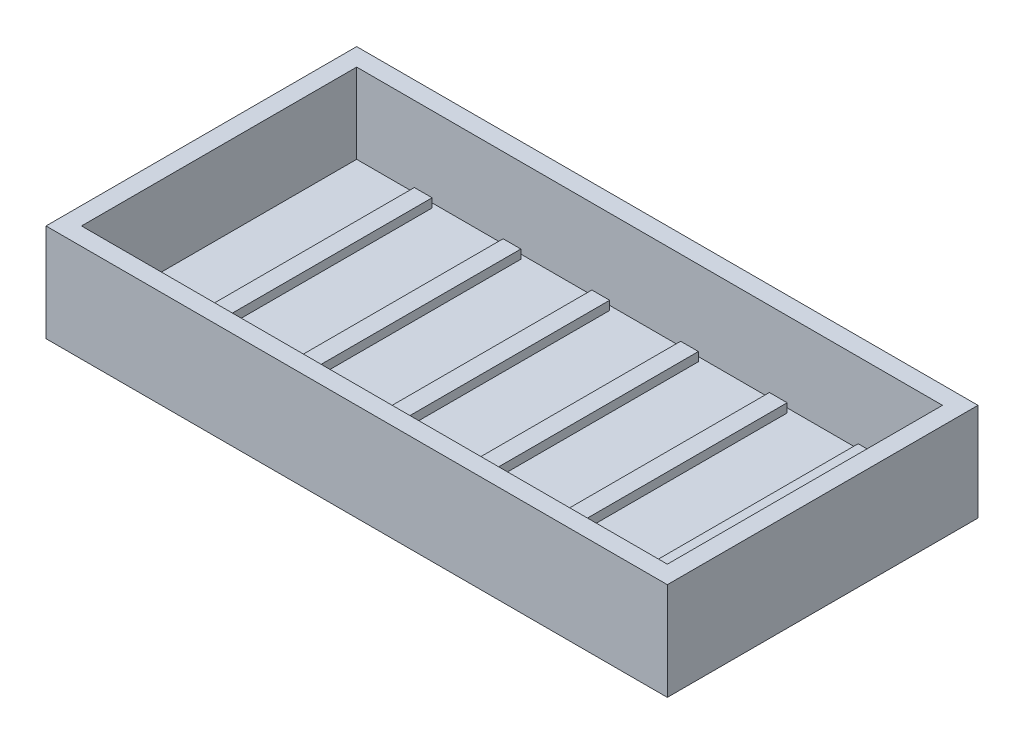
ISO-10303-21;
HEADER;
FILE_DESCRIPTION(('STEP AP214'),'2;1');
FILE_NAME('part.step','',(''),(''),'','','');
FILE_SCHEMA(('AUTOMOTIVE_DESIGN { 1 0 10303 214 1 1 1 1 }'));
ENDSEC;
DATA;
#1=APPLICATION_CONTEXT('core data for automotive mechanical design processes');
#2=APPLICATION_PROTOCOL_DEFINITION('international standard','automotive_design',2000,#1);
#3=PRODUCT_CONTEXT('',#1,'mechanical');
#4=PRODUCT('Part','Part','',(#3));
#5=PRODUCT_RELATED_PRODUCT_CATEGORY('part','',(#4));
#6=PRODUCT_DEFINITION_FORMATION('','',#4);
#7=PRODUCT_DEFINITION_CONTEXT('part definition',#1,'design');
#8=PRODUCT_DEFINITION('design','',#6,#7);
#9=PRODUCT_DEFINITION_SHAPE('','',#8);
#10=(LENGTH_UNIT() NAMED_UNIT(*) SI_UNIT(.MILLI.,.METRE.));
#11=(NAMED_UNIT(*) PLANE_ANGLE_UNIT() SI_UNIT($,.RADIAN.));
#12=(NAMED_UNIT(*) SI_UNIT($,.STERADIAN.) SOLID_ANGLE_UNIT());
#13=UNCERTAINTY_MEASURE_WITH_UNIT(LENGTH_MEASURE(1.E-05),#10,'distance_accuracy_value','');
#14=(GEOMETRIC_REPRESENTATION_CONTEXT(3) GLOBAL_UNCERTAINTY_ASSIGNED_CONTEXT((#13)) GLOBAL_UNIT_ASSIGNED_CONTEXT((#10,
#11,#12)) REPRESENTATION_CONTEXT('',''));
#15=CARTESIAN_POINT('',(0.,0.,0.));
#16=DIRECTION('',(0.,0.,1.));
#17=DIRECTION('',(1.,0.,0.));
#18=AXIS2_PLACEMENT_3D('',#15,#16,#17);
#19=CARTESIAN_POINT('',(0.,4.,0.));
#20=DIRECTION('',(0.,1.,0.));
#21=DIRECTION('',(0.,0.,1.));
#22=AXIS2_PLACEMENT_3D('',#19,#20,#21);
#23=PLANE('',#22);
#24=DIRECTION('',(0.,0.,1.));
#25=VECTOR('',#24,1.);
#26=CARTESIAN_POINT('',(-66.,4.,4.));
#27=LINE('',#26,#25);
#28=CARTESIAN_POINT('',(-66.,4.,4.));
#29=VERTEX_POINT('',#28);
#30=CARTESIAN_POINT('',(-66.,4.,66.));
#31=VERTEX_POINT('',#30);
#32=EDGE_CURVE('E497',#29,#31,#27,.T.);
#33=ORIENTED_EDGE('',*,*,#32,.T.);
#34=DIRECTION('',(1.,0.,0.));
#35=VECTOR('',#34,1.);
#36=CARTESIAN_POINT('',(-66.,4.,66.));
#37=LINE('',#36,#35);
#38=CARTESIAN_POINT('',(66.,4.,66.));
#39=VERTEX_POINT('',#38);
#40=EDGE_CURVE('E498',#31,#39,#37,.T.);
#41=ORIENTED_EDGE('',*,*,#40,.T.);
#42=DIRECTION('',(0.,0.,-1.));
#43=VECTOR('',#42,1.);
#44=CARTESIAN_POINT('',(66.,4.,66.));
#45=LINE('',#44,#43);
#46=CARTESIAN_POINT('',(66.,4.,4.));
#47=VERTEX_POINT('',#46);
#48=EDGE_CURVE('E504',#39,#47,#45,.T.);
#49=ORIENTED_EDGE('',*,*,#48,.T.);
#50=DIRECTION('',(-1.,0.,0.));
#51=VECTOR('',#50,1.);
#52=CARTESIAN_POINT('',(66.,4.,4.));
#53=LINE('',#52,#51);
#54=EDGE_CURVE('E506',#47,#29,#53,.T.);
#55=ORIENTED_EDGE('',*,*,#54,.T.);
#56=EDGE_LOOP('',(#33,#41,#49,#55));
#57=FACE_BOUND('',#56,.T.);
#58=DIRECTION('',(1.,0.,0.));
#59=VECTOR('',#58,1.);
#60=CARTESIAN_POINT('',(48.,4.,65.));
#61=LINE('',#60,#59);
#62=CARTESIAN_POINT('',(48.,4.,65.));
#63=VERTEX_POINT('',#62);
#64=CARTESIAN_POINT('',(52.,4.,65.));
#65=VERTEX_POINT('',#64);
#66=EDGE_CURVE('E479',#63,#65,#61,.T.);
#67=ORIENTED_EDGE('',*,*,#66,.F.);
#68=DIRECTION('',(0.,0.,1.));
#69=VECTOR('',#68,1.);
#70=CARTESIAN_POINT('',(48.,4.,5.));
#71=LINE('',#70,#69);
#72=CARTESIAN_POINT('',(48.,4.,5.));
#73=VERTEX_POINT('',#72);
#74=EDGE_CURVE('E420',#73,#63,#71,.T.);
#75=ORIENTED_EDGE('',*,*,#74,.F.);
#76=DIRECTION('',(-1.,0.,0.));
#77=VECTOR('',#76,1.);
#78=CARTESIAN_POINT('',(52.,4.,5.));
#79=LINE('',#78,#77);
#80=CARTESIAN_POINT('',(52.,4.,5.));
#81=VERTEX_POINT('',#80);
#82=EDGE_CURVE('E473',#81,#73,#79,.T.);
#83=ORIENTED_EDGE('',*,*,#82,.F.);
#84=DIRECTION('',(0.,0.,-1.));
#85=VECTOR('',#84,1.);
#86=CARTESIAN_POINT('',(52.,4.,65.));
#87=LINE('',#86,#85);
#88=EDGE_CURVE('E475',#65,#81,#87,.T.);
#89=ORIENTED_EDGE('',*,*,#88,.F.);
#90=EDGE_LOOP('',(#67,#75,#83,#89));
#91=FACE_BOUND('',#90,.T.);
#92=DIRECTION('',(1.,0.,0.));
#93=VECTOR('',#92,1.);
#94=CARTESIAN_POINT('',(28.,4.,65.));
#95=LINE('',#94,#93);
#96=CARTESIAN_POINT('',(28.,4.,65.));
#97=VERTEX_POINT('',#96);
#98=CARTESIAN_POINT('',(32.,4.,65.));
#99=VERTEX_POINT('',#98);
#100=EDGE_CURVE('E438',#97,#99,#95,.T.);
#101=ORIENTED_EDGE('',*,*,#100,.F.);
#102=DIRECTION('',(0.,0.,1.));
#103=VECTOR('',#102,1.);
#104=CARTESIAN_POINT('',(28.,4.,5.));
#105=LINE('',#104,#103);
#106=CARTESIAN_POINT('',(28.,4.,5.));
#107=VERTEX_POINT('',#106);
#108=EDGE_CURVE('E378',#107,#97,#105,.T.);
#109=ORIENTED_EDGE('',*,*,#108,.F.);
#110=DIRECTION('',(-1.,0.,0.));
#111=VECTOR('',#110,1.);
#112=CARTESIAN_POINT('',(32.,4.,5.));
#113=LINE('',#112,#111);
#114=CARTESIAN_POINT('',(32.,4.,5.));
#115=VERTEX_POINT('',#114);
#116=EDGE_CURVE('E431',#115,#107,#113,.T.);
#117=ORIENTED_EDGE('',*,*,#116,.F.);
#118=DIRECTION('',(0.,0.,-1.));
#119=VECTOR('',#118,1.);
#120=CARTESIAN_POINT('',(32.,4.,65.));
#121=LINE('',#120,#119);
#122=EDGE_CURVE('E432',#99,#115,#121,.T.);
#123=ORIENTED_EDGE('',*,*,#122,.F.);
#124=EDGE_LOOP('',(#101,#109,#117,#123));
#125=FACE_BOUND('',#124,.T.);
#126=DIRECTION('',(1.,0.,0.));
#127=VECTOR('',#126,1.);
#128=CARTESIAN_POINT('',(8.,4.,65.));
#129=LINE('',#128,#127);
#130=CARTESIAN_POINT('',(8.,4.,65.));
#131=VERTEX_POINT('',#130);
#132=CARTESIAN_POINT('',(12.,4.,65.));
#133=VERTEX_POINT('',#132);
#134=EDGE_CURVE('E400',#131,#133,#129,.T.);
#135=ORIENTED_EDGE('',*,*,#134,.F.);
#136=DIRECTION('',(0.,0.,1.));
#137=VECTOR('',#136,1.);
#138=CARTESIAN_POINT('',(8.,4.,5.));
#139=LINE('',#138,#137);
#140=CARTESIAN_POINT('',(8.,4.,5.));
#141=VERTEX_POINT('',#140);
#142=EDGE_CURVE('E340',#141,#131,#139,.T.);
#143=ORIENTED_EDGE('',*,*,#142,.F.);
#144=DIRECTION('',(-1.,0.,0.));
#145=VECTOR('',#144,1.);
#146=CARTESIAN_POINT('',(12.,4.,5.));
#147=LINE('',#146,#145);
#148=CARTESIAN_POINT('',(12.,4.,5.));
#149=VERTEX_POINT('',#148);
#150=EDGE_CURVE('E388',#149,#141,#147,.T.);
#151=ORIENTED_EDGE('',*,*,#150,.F.);
#152=DIRECTION('',(0.,0.,-1.));
#153=VECTOR('',#152,1.);
#154=CARTESIAN_POINT('',(12.,4.,65.));
#155=LINE('',#154,#153);
#156=EDGE_CURVE('E392',#133,#149,#155,.T.);
#157=ORIENTED_EDGE('',*,*,#156,.F.);
#158=EDGE_LOOP('',(#135,#143,#151,#157));
#159=FACE_BOUND('',#158,.T.);
#160=DIRECTION('',(1.,0.,0.));
#161=VECTOR('',#160,1.);
#162=CARTESIAN_POINT('',(-12.,4.,65.));
#163=LINE('',#162,#161);
#164=CARTESIAN_POINT('',(-12.,4.,65.));
#165=VERTEX_POINT('',#164);
#166=CARTESIAN_POINT('',(-8.,4.,65.));
#167=VERTEX_POINT('',#166);
#168=EDGE_CURVE('E359',#165,#167,#163,.T.);
#169=ORIENTED_EDGE('',*,*,#168,.F.);
#170=DIRECTION('',(0.,0.,1.));
#171=VECTOR('',#170,1.);
#172=CARTESIAN_POINT('',(-12.,4.,5.));
#173=LINE('',#172,#171);
#174=CARTESIAN_POINT('',(-12.,4.,5.));
#175=VERTEX_POINT('',#174);
#176=EDGE_CURVE('E300',#175,#165,#173,.T.);
#177=ORIENTED_EDGE('',*,*,#176,.F.);
#178=DIRECTION('',(-1.,0.,0.));
#179=VECTOR('',#178,1.);
#180=CARTESIAN_POINT('',(-8.,4.,5.));
#181=LINE('',#180,#179);
#182=CARTESIAN_POINT('',(-8.,4.,5.));
#183=VERTEX_POINT('',#182);
#184=EDGE_CURVE('E349',#183,#175,#181,.T.);
#185=ORIENTED_EDGE('',*,*,#184,.F.);
#186=DIRECTION('',(0.,0.,-1.));
#187=VECTOR('',#186,1.);
#188=CARTESIAN_POINT('',(-8.,4.,65.));
#189=LINE('',#188,#187);
#190=EDGE_CURVE('E355',#167,#183,#189,.T.);
#191=ORIENTED_EDGE('',*,*,#190,.F.);
#192=EDGE_LOOP('',(#169,#177,#185,#191));
#193=FACE_BOUND('',#192,.T.);
#194=DIRECTION('',(1.,0.,0.));
#195=VECTOR('',#194,1.);
#196=CARTESIAN_POINT('',(-32.,4.,65.));
#197=LINE('',#196,#195);
#198=CARTESIAN_POINT('',(-32.,4.,65.));
#199=VERTEX_POINT('',#198);
#200=CARTESIAN_POINT('',(-28.,4.,65.));
#201=VERTEX_POINT('',#200);
#202=EDGE_CURVE('E312',#199,#201,#197,.T.);
#203=ORIENTED_EDGE('',*,*,#202,.F.);
#204=DIRECTION('',(0.,0.,1.));
#205=VECTOR('',#204,1.);
#206=CARTESIAN_POINT('',(-32.,4.,5.));
#207=LINE('',#206,#205);
#208=CARTESIAN_POINT('',(-32.,4.,5.));
#209=VERTEX_POINT('',#208);
#210=EDGE_CURVE('E318',#209,#199,#207,.T.);
#211=ORIENTED_EDGE('',*,*,#210,.F.);
#212=DIRECTION('',(-1.,0.,0.));
#213=VECTOR('',#212,1.);
#214=CARTESIAN_POINT('',(-28.,4.,5.));
#215=LINE('',#214,#213);
#216=CARTESIAN_POINT('',(-28.,4.,5.));
#217=VERTEX_POINT('',#216);
#218=EDGE_CURVE('E306',#217,#209,#215,.T.);
#219=ORIENTED_EDGE('',*,*,#218,.F.);
#220=DIRECTION('',(0.,0.,-1.));
#221=VECTOR('',#220,1.);
#222=CARTESIAN_POINT('',(-28.,4.,65.));
#223=LINE('',#222,#221);
#224=EDGE_CURVE('E313',#201,#217,#223,.T.);
#225=ORIENTED_EDGE('',*,*,#224,.F.);
#226=EDGE_LOOP('',(#203,#211,#219,#225));
#227=FACE_BOUND('',#226,.T.);
#228=DIRECTION('',(1.,0.,0.));
#229=VECTOR('',#228,1.);
#230=CARTESIAN_POINT('',(-52.,4.,65.));
#231=LINE('',#230,#229);
#232=CARTESIAN_POINT('',(-52.,4.,65.));
#233=VERTEX_POINT('',#232);
#234=CARTESIAN_POINT('',(-48.,4.,65.));
#235=VERTEX_POINT('',#234);
#236=EDGE_CURVE('E969',#233,#235,#231,.T.);
#237=ORIENTED_EDGE('',*,*,#236,.F.);
#238=DIRECTION('',(0.,0.,1.));
#239=VECTOR('',#238,1.);
#240=CARTESIAN_POINT('',(-52.,4.,5.));
#241=LINE('',#240,#239);
#242=CARTESIAN_POINT('',(-52.,4.,5.));
#243=VERTEX_POINT('',#242);
#244=EDGE_CURVE('E281',#243,#233,#241,.T.);
#245=ORIENTED_EDGE('',*,*,#244,.F.);
#246=DIRECTION('',(-1.,0.,0.));
#247=VECTOR('',#246,1.);
#248=CARTESIAN_POINT('',(-48.,4.,5.));
#249=LINE('',#248,#247);
#250=CARTESIAN_POINT('',(-48.,4.,5.));
#251=VERTEX_POINT('',#250);
#252=EDGE_CURVE('E280',#251,#243,#249,.T.);
#253=ORIENTED_EDGE('',*,*,#252,.F.);
#254=DIRECTION('',(0.,0.,-1.));
#255=VECTOR('',#254,1.);
#256=CARTESIAN_POINT('',(-48.,4.,65.));
#257=LINE('',#256,#255);
#258=EDGE_CURVE('E968',#235,#251,#257,.T.);
#259=ORIENTED_EDGE('',*,*,#258,.F.);
#260=EDGE_LOOP('',(#237,#245,#253,#259));
#261=FACE_BOUND('',#260,.T.);
#262=ADVANCED_FACE('F44',(#57,#91,#125,#159,#193,#227,#261),#23,.T.);
#263=CARTESIAN_POINT('',(-70.,22.,0.));
#264=DIRECTION('',(1.,0.,0.));
#265=DIRECTION('',(0.,0.,-1.));
#266=AXIS2_PLACEMENT_3D('',#263,#264,#265);
#267=PLANE('',#266);
#268=DIRECTION('',(0.,0.,1.));
#269=VECTOR('',#268,1.);
#270=CARTESIAN_POINT('',(-70.,0.,0.));
#271=LINE('',#270,#269);
#272=CARTESIAN_POINT('',(-70.,0.,0.));
#273=VERTEX_POINT('',#272);
#274=CARTESIAN_POINT('',(-70.,0.,70.));
#275=VERTEX_POINT('',#274);
#276=EDGE_CURVE('E527',#273,#275,#271,.T.);
#277=ORIENTED_EDGE('',*,*,#276,.T.);
#278=DIRECTION('',(0.,-1.,0.));
#279=VECTOR('',#278,1.);
#280=CARTESIAN_POINT('',(-70.,22.,70.));
#281=LINE('',#280,#279);
#282=CARTESIAN_POINT('',(-70.,22.,70.));
#283=VERTEX_POINT('',#282);
#284=EDGE_CURVE('E11',#283,#275,#281,.T.);
#285=ORIENTED_EDGE('',*,*,#284,.F.);
#286=DIRECTION('',(0.,0.,1.));
#287=VECTOR('',#286,1.);
#288=CARTESIAN_POINT('',(-70.,22.,0.));
#289=LINE('',#288,#287);
#290=CARTESIAN_POINT('',(-70.,22.,0.));
#291=VERTEX_POINT('',#290);
#292=EDGE_CURVE('E540',#291,#283,#289,.T.);
#293=ORIENTED_EDGE('',*,*,#292,.F.);
#294=DIRECTION('',(0.,-1.,0.));
#295=VECTOR('',#294,1.);
#296=CARTESIAN_POINT('',(-70.,22.,0.));
#297=LINE('',#296,#295);
#298=EDGE_CURVE('E552',#291,#273,#297,.T.);
#299=ORIENTED_EDGE('',*,*,#298,.T.);
#300=EDGE_LOOP('',(#277,#285,#293,#299));
#301=FACE_BOUND('',#300,.T.);
#302=ADVANCED_FACE('F50',(#301),#267,.F.);
#303=CARTESIAN_POINT('',(-70.,22.,70.));
#304=DIRECTION('',(0.,0.,-1.));
#305=DIRECTION('',(-1.,0.,0.));
#306=AXIS2_PLACEMENT_3D('',#303,#304,#305);
#307=PLANE('',#306);
#308=DIRECTION('',(1.,0.,0.));
#309=VECTOR('',#308,1.);
#310=CARTESIAN_POINT('',(-70.,0.,70.));
#311=LINE('',#310,#309);
#312=CARTESIAN_POINT('',(70.,0.,70.));
#313=VERTEX_POINT('',#312);
#314=EDGE_CURVE('E553',#275,#313,#311,.T.);
#315=ORIENTED_EDGE('',*,*,#314,.T.);
#316=DIRECTION('',(0.,-1.,0.));
#317=VECTOR('',#316,1.);
#318=CARTESIAN_POINT('',(70.,22.,70.));
#319=LINE('',#318,#317);
#320=CARTESIAN_POINT('',(70.,22.,70.));
#321=VERTEX_POINT('',#320);
#322=EDGE_CURVE('E53',#321,#313,#319,.T.);
#323=ORIENTED_EDGE('',*,*,#322,.F.);
#324=DIRECTION('',(1.,0.,0.));
#325=VECTOR('',#324,1.);
#326=CARTESIAN_POINT('',(-70.,22.,70.));
#327=LINE('',#326,#325);
#328=EDGE_CURVE('E541',#283,#321,#327,.T.);
#329=ORIENTED_EDGE('',*,*,#328,.F.);
#330=ORIENTED_EDGE('',*,*,#284,.T.);
#331=EDGE_LOOP('',(#315,#323,#329,#330));
#332=FACE_BOUND('',#331,.T.);
#333=ADVANCED_FACE('F591',(#332),#307,.F.);
#334=CARTESIAN_POINT('',(70.,22.,70.));
#335=DIRECTION('',(-1.,0.,0.));
#336=DIRECTION('',(0.,0.,1.));
#337=AXIS2_PLACEMENT_3D('',#334,#335,#336);
#338=PLANE('',#337);
#339=DIRECTION('',(0.,0.,-1.));
#340=VECTOR('',#339,1.);
#341=CARTESIAN_POINT('',(70.,0.,70.));
#342=LINE('',#341,#340);
#343=CARTESIAN_POINT('',(70.,0.,0.));
#344=VERTEX_POINT('',#343);
#345=EDGE_CURVE('E557',#313,#344,#342,.T.);
#346=ORIENTED_EDGE('',*,*,#345,.T.);
#347=DIRECTION('',(0.,-1.,0.));
#348=VECTOR('',#347,1.);
#349=CARTESIAN_POINT('',(70.,22.,0.));
#350=LINE('',#349,#348);
#351=CARTESIAN_POINT('',(70.,22.,0.));
#352=VERTEX_POINT('',#351);
#353=EDGE_CURVE('E567',#352,#344,#350,.T.);
#354=ORIENTED_EDGE('',*,*,#353,.F.);
#355=DIRECTION('',(0.,0.,-1.));
#356=VECTOR('',#355,1.);
#357=CARTESIAN_POINT('',(70.,22.,70.));
#358=LINE('',#357,#356);
#359=EDGE_CURVE('E544',#321,#352,#358,.T.);
#360=ORIENTED_EDGE('',*,*,#359,.F.);
#361=ORIENTED_EDGE('',*,*,#322,.T.);
#362=EDGE_LOOP('',(#346,#354,#360,#361));
#363=FACE_BOUND('',#362,.T.);
#364=ADVANCED_FACE('F574',(#363),#338,.F.);
#365=CARTESIAN_POINT('',(70.,22.,0.));
#366=DIRECTION('',(0.,0.,1.));
#367=DIRECTION('',(1.,0.,0.));
#368=AXIS2_PLACEMENT_3D('',#365,#366,#367);
#369=PLANE('',#368);
#370=DIRECTION('',(-1.,0.,0.));
#371=VECTOR('',#370,1.);
#372=CARTESIAN_POINT('',(70.,0.,0.));
#373=LINE('',#372,#371);
#374=EDGE_CURVE('E545',#344,#273,#373,.T.);
#375=ORIENTED_EDGE('',*,*,#374,.T.);
#376=ORIENTED_EDGE('',*,*,#298,.F.);
#377=DIRECTION('',(-1.,0.,0.));
#378=VECTOR('',#377,1.);
#379=CARTESIAN_POINT('',(70.,22.,0.));
#380=LINE('',#379,#378);
#381=EDGE_CURVE('E547',#352,#291,#380,.T.);
#382=ORIENTED_EDGE('',*,*,#381,.F.);
#383=ORIENTED_EDGE('',*,*,#353,.T.);
#384=EDGE_LOOP('',(#375,#376,#382,#383));
#385=FACE_BOUND('',#384,.T.);
#386=ADVANCED_FACE('F585',(#385),#369,.F.);
#387=CARTESIAN_POINT('',(0.,22.,0.));
#388=DIRECTION('',(0.,1.,0.));
#389=DIRECTION('',(0.,0.,1.));
#390=AXIS2_PLACEMENT_3D('',#387,#388,#389);
#391=PLANE('',#390);
#392=DIRECTION('',(0.,0.,1.));
#393=VECTOR('',#392,1.);
#394=CARTESIAN_POINT('',(-66.,22.,4.));
#395=LINE('',#394,#393);
#396=CARTESIAN_POINT('',(-66.,22.,4.));
#397=VERTEX_POINT('',#396);
#398=CARTESIAN_POINT('',(-66.,22.,66.));
#399=VERTEX_POINT('',#398);
#400=EDGE_CURVE('E283',#397,#399,#395,.T.);
#401=ORIENTED_EDGE('',*,*,#400,.F.);
#402=DIRECTION('',(-1.,0.,0.));
#403=VECTOR('',#402,1.);
#404=CARTESIAN_POINT('',(66.,22.,4.));
#405=LINE('',#404,#403);
#406=CARTESIAN_POINT('',(66.,22.,4.));
#407=VERTEX_POINT('',#406);
#408=EDGE_CURVE('E501',#407,#397,#405,.T.);
#409=ORIENTED_EDGE('',*,*,#408,.F.);
#410=DIRECTION('',(0.,0.,-1.));
#411=VECTOR('',#410,1.);
#412=CARTESIAN_POINT('',(66.,22.,66.));
#413=LINE('',#412,#411);
#414=CARTESIAN_POINT('',(66.,22.,66.));
#415=VERTEX_POINT('',#414);
#416=EDGE_CURVE('E520',#415,#407,#413,.T.);
#417=ORIENTED_EDGE('',*,*,#416,.F.);
#418=DIRECTION('',(1.,0.,0.));
#419=VECTOR('',#418,1.);
#420=CARTESIAN_POINT('',(-66.,22.,66.));
#421=LINE('',#420,#419);
#422=EDGE_CURVE('E290',#399,#415,#421,.T.);
#423=ORIENTED_EDGE('',*,*,#422,.F.);
#424=EDGE_LOOP('',(#401,#409,#417,#423));
#425=FACE_BOUND('',#424,.T.);
#426=ORIENTED_EDGE('',*,*,#292,.T.);
#427=ORIENTED_EDGE('',*,*,#328,.T.);
#428=ORIENTED_EDGE('',*,*,#359,.T.);
#429=ORIENTED_EDGE('',*,*,#381,.T.);
#430=EDGE_LOOP('',(#426,#427,#428,#429));
#431=FACE_BOUND('',#430,.T.);
#432=ADVANCED_FACE('F587',(#425,#431),#391,.T.);
#433=CARTESIAN_POINT('',(0.,0.,0.));
#434=DIRECTION('',(0.,1.,0.));
#435=DIRECTION('',(0.,0.,1.));
#436=AXIS2_PLACEMENT_3D('',#433,#434,#435);
#437=PLANE('',#436);
#438=ORIENTED_EDGE('',*,*,#276,.F.);
#439=ORIENTED_EDGE('',*,*,#374,.F.);
#440=ORIENTED_EDGE('',*,*,#345,.F.);
#441=ORIENTED_EDGE('',*,*,#314,.F.);
#442=EDGE_LOOP('',(#438,#439,#440,#441));
#443=FACE_BOUND('',#442,.T.);
#444=ADVANCED_FACE('F583',(#443),#437,.F.);
#445=CARTESIAN_POINT('',(-66.,4.,4.));
#446=DIRECTION('',(-1.,0.,0.));
#447=DIRECTION('',(0.,0.,1.));
#448=AXIS2_PLACEMENT_3D('',#445,#446,#447);
#449=PLANE('',#448);
#450=ORIENTED_EDGE('',*,*,#400,.T.);
#451=DIRECTION('',(0.,1.,0.));
#452=VECTOR('',#451,1.);
#453=CARTESIAN_POINT('',(-66.,4.,66.));
#454=LINE('',#453,#452);
#455=EDGE_CURVE('E515',#31,#399,#454,.T.);
#456=ORIENTED_EDGE('',*,*,#455,.F.);
#457=ORIENTED_EDGE('',*,*,#32,.F.);
#458=DIRECTION('',(0.,1.,0.));
#459=VECTOR('',#458,1.);
#460=CARTESIAN_POINT('',(-66.,4.,4.));
#461=LINE('',#460,#459);
#462=EDGE_CURVE('E521',#29,#397,#461,.T.);
#463=ORIENTED_EDGE('',*,*,#462,.T.);
#464=EDGE_LOOP('',(#450,#456,#457,#463));
#465=FACE_BOUND('',#464,.T.);
#466=ADVANCED_FACE('F613',(#465),#449,.F.);
#467=CARTESIAN_POINT('',(66.,4.,4.));
#468=DIRECTION('',(0.,0.,-1.));
#469=DIRECTION('',(-1.,0.,0.));
#470=AXIS2_PLACEMENT_3D('',#467,#468,#469);
#471=PLANE('',#470);
#472=ORIENTED_EDGE('',*,*,#408,.T.);
#473=ORIENTED_EDGE('',*,*,#462,.F.);
#474=ORIENTED_EDGE('',*,*,#54,.F.);
#475=DIRECTION('',(0.,1.,0.));
#476=VECTOR('',#475,1.);
#477=CARTESIAN_POINT('',(66.,4.,4.));
#478=LINE('',#477,#476);
#479=EDGE_CURVE('E526',#47,#407,#478,.T.);
#480=ORIENTED_EDGE('',*,*,#479,.T.);
#481=EDGE_LOOP('',(#472,#473,#474,#480));
#482=FACE_BOUND('',#481,.T.);
#483=ADVANCED_FACE('F608',(#482),#471,.F.);
#484=CARTESIAN_POINT('',(66.,4.,66.));
#485=DIRECTION('',(1.,0.,0.));
#486=DIRECTION('',(0.,0.,-1.));
#487=AXIS2_PLACEMENT_3D('',#484,#485,#486);
#488=PLANE('',#487);
#489=ORIENTED_EDGE('',*,*,#416,.T.);
#490=ORIENTED_EDGE('',*,*,#479,.F.);
#491=ORIENTED_EDGE('',*,*,#48,.F.);
#492=DIRECTION('',(0.,1.,0.));
#493=VECTOR('',#492,1.);
#494=CARTESIAN_POINT('',(66.,4.,66.));
#495=LINE('',#494,#493);
#496=EDGE_CURVE('E533',#39,#415,#495,.T.);
#497=ORIENTED_EDGE('',*,*,#496,.T.);
#498=EDGE_LOOP('',(#489,#490,#491,#497));
#499=FACE_BOUND('',#498,.T.);
#500=ADVANCED_FACE('F612',(#499),#488,.F.);
#501=CARTESIAN_POINT('',(-66.,4.,66.));
#502=DIRECTION('',(0.,0.,1.));
#503=DIRECTION('',(1.,0.,0.));
#504=AXIS2_PLACEMENT_3D('',#501,#502,#503);
#505=PLANE('',#504);
#506=ORIENTED_EDGE('',*,*,#422,.T.);
#507=ORIENTED_EDGE('',*,*,#496,.F.);
#508=ORIENTED_EDGE('',*,*,#40,.F.);
#509=ORIENTED_EDGE('',*,*,#455,.T.);
#510=EDGE_LOOP('',(#506,#507,#508,#509));
#511=FACE_BOUND('',#510,.T.);
#512=ADVANCED_FACE('F620',(#511),#505,.F.);
#513=CARTESIAN_POINT('',(48.,6.,5.));
#514=DIRECTION('',(1.,0.,0.));
#515=DIRECTION('',(0.,0.,-1.));
#516=AXIS2_PLACEMENT_3D('',#513,#514,#515);
#517=PLANE('',#516);
#518=ORIENTED_EDGE('',*,*,#74,.T.);
#519=DIRECTION('',(0.,-1.,0.));
#520=VECTOR('',#519,1.);
#521=CARTESIAN_POINT('',(48.,6.,65.));
#522=LINE('',#521,#520);
#523=CARTESIAN_POINT('',(48.,6.,65.));
#524=VERTEX_POINT('',#523);
#525=EDGE_CURVE('E457',#524,#63,#522,.T.);
#526=ORIENTED_EDGE('',*,*,#525,.F.);
#527=DIRECTION('',(0.,0.,1.));
#528=VECTOR('',#527,1.);
#529=CARTESIAN_POINT('',(48.,6.,5.));
#530=LINE('',#529,#528);
#531=CARTESIAN_POINT('',(48.,6.,5.));
#532=VERTEX_POINT('',#531);
#533=EDGE_CURVE('E474',#532,#524,#530,.T.);
#534=ORIENTED_EDGE('',*,*,#533,.F.);
#535=DIRECTION('',(0.,-1.,0.));
#536=VECTOR('',#535,1.);
#537=CARTESIAN_POINT('',(48.,6.,5.));
#538=LINE('',#537,#536);
#539=EDGE_CURVE('E467',#532,#73,#538,.T.);
#540=ORIENTED_EDGE('',*,*,#539,.T.);
#541=EDGE_LOOP('',(#518,#526,#534,#540));
#542=FACE_BOUND('',#541,.T.);
#543=ADVANCED_FACE('F622',(#542),#517,.F.);
#544=CARTESIAN_POINT('',(48.,6.,65.));
#545=DIRECTION('',(0.,0.,-1.));
#546=DIRECTION('',(-1.,0.,0.));
#547=AXIS2_PLACEMENT_3D('',#544,#545,#546);
#548=PLANE('',#547);
#549=ORIENTED_EDGE('',*,*,#66,.T.);
#550=DIRECTION('',(0.,-1.,0.));
#551=VECTOR('',#550,1.);
#552=CARTESIAN_POINT('',(52.,6.,65.));
#553=LINE('',#552,#551);
#554=CARTESIAN_POINT('',(52.,6.,65.));
#555=VERTEX_POINT('',#554);
#556=EDGE_CURVE('E459',#555,#65,#553,.T.);
#557=ORIENTED_EDGE('',*,*,#556,.F.);
#558=DIRECTION('',(1.,0.,0.));
#559=VECTOR('',#558,1.);
#560=CARTESIAN_POINT('',(48.,6.,65.));
#561=LINE('',#560,#559);
#562=EDGE_CURVE('E489',#524,#555,#561,.T.);
#563=ORIENTED_EDGE('',*,*,#562,.F.);
#564=ORIENTED_EDGE('',*,*,#525,.T.);
#565=EDGE_LOOP('',(#549,#557,#563,#564));
#566=FACE_BOUND('',#565,.T.);
#567=ADVANCED_FACE('F679',(#566),#548,.F.);
#568=CARTESIAN_POINT('',(52.,6.,65.));
#569=DIRECTION('',(-1.,0.,0.));
#570=DIRECTION('',(0.,0.,1.));
#571=AXIS2_PLACEMENT_3D('',#568,#569,#570);
#572=PLANE('',#571);
#573=ORIENTED_EDGE('',*,*,#88,.T.);
#574=DIRECTION('',(0.,-1.,0.));
#575=VECTOR('',#574,1.);
#576=CARTESIAN_POINT('',(52.,6.,5.));
#577=LINE('',#576,#575);
#578=CARTESIAN_POINT('',(52.,6.,5.));
#579=VERTEX_POINT('',#578);
#580=EDGE_CURVE('E462',#579,#81,#577,.T.);
#581=ORIENTED_EDGE('',*,*,#580,.F.);
#582=DIRECTION('',(0.,0.,-1.));
#583=VECTOR('',#582,1.);
#584=CARTESIAN_POINT('',(52.,6.,65.));
#585=LINE('',#584,#583);
#586=EDGE_CURVE('E490',#555,#579,#585,.T.);
#587=ORIENTED_EDGE('',*,*,#586,.F.);
#588=ORIENTED_EDGE('',*,*,#556,.T.);
#589=EDGE_LOOP('',(#573,#581,#587,#588));
#590=FACE_BOUND('',#589,.T.);
#591=ADVANCED_FACE('F686',(#590),#572,.F.);
#592=CARTESIAN_POINT('',(52.,6.,5.));
#593=DIRECTION('',(0.,0.,1.));
#594=DIRECTION('',(1.,0.,0.));
#595=AXIS2_PLACEMENT_3D('',#592,#593,#594);
#596=PLANE('',#595);
#597=ORIENTED_EDGE('',*,*,#82,.T.);
#598=ORIENTED_EDGE('',*,*,#539,.F.);
#599=DIRECTION('',(-1.,0.,0.));
#600=VECTOR('',#599,1.);
#601=CARTESIAN_POINT('',(52.,6.,5.));
#602=LINE('',#601,#600);
#603=EDGE_CURVE('E468',#579,#532,#602,.T.);
#604=ORIENTED_EDGE('',*,*,#603,.F.);
#605=ORIENTED_EDGE('',*,*,#580,.T.);
#606=EDGE_LOOP('',(#597,#598,#604,#605));
#607=FACE_BOUND('',#606,.T.);
#608=ADVANCED_FACE('F699',(#607),#596,.F.);
#609=CARTESIAN_POINT('',(0.,6.,0.));
#610=DIRECTION('',(0.,1.,0.));
#611=DIRECTION('',(0.,0.,1.));
#612=AXIS2_PLACEMENT_3D('',#609,#610,#611);
#613=PLANE('',#612);
#614=ORIENTED_EDGE('',*,*,#533,.T.);
#615=ORIENTED_EDGE('',*,*,#562,.T.);
#616=ORIENTED_EDGE('',*,*,#586,.T.);
#617=ORIENTED_EDGE('',*,*,#603,.T.);
#618=EDGE_LOOP('',(#614,#615,#616,#617));
#619=FACE_BOUND('',#618,.T.);
#620=ADVANCED_FACE('F609',(#619),#613,.T.);
#621=CARTESIAN_POINT('',(28.,6.,5.));
#622=DIRECTION('',(1.,0.,0.));
#623=DIRECTION('',(0.,0.,-1.));
#624=AXIS2_PLACEMENT_3D('',#621,#622,#623);
#625=PLANE('',#624);
#626=ORIENTED_EDGE('',*,*,#108,.T.);
#627=DIRECTION('',(0.,-1.,0.));
#628=VECTOR('',#627,1.);
#629=CARTESIAN_POINT('',(28.,6.,65.));
#630=LINE('',#629,#628);
#631=CARTESIAN_POINT('',(28.,6.,65.));
#632=VERTEX_POINT('',#631);
#633=EDGE_CURVE('E413',#632,#97,#630,.T.);
#634=ORIENTED_EDGE('',*,*,#633,.F.);
#635=DIRECTION('',(0.,0.,1.));
#636=VECTOR('',#635,1.);
#637=CARTESIAN_POINT('',(28.,6.,5.));
#638=LINE('',#637,#636);
#639=CARTESIAN_POINT('',(28.,6.,5.));
#640=VERTEX_POINT('',#639);
#641=EDGE_CURVE('E434',#640,#632,#638,.T.);
#642=ORIENTED_EDGE('',*,*,#641,.F.);
#643=DIRECTION('',(0.,-1.,0.));
#644=VECTOR('',#643,1.);
#645=CARTESIAN_POINT('',(28.,6.,5.));
#646=LINE('',#645,#644);
#647=EDGE_CURVE('E426',#640,#107,#646,.T.);
#648=ORIENTED_EDGE('',*,*,#647,.T.);
#649=EDGE_LOOP('',(#626,#634,#642,#648));
#650=FACE_BOUND('',#649,.T.);
#651=ADVANCED_FACE('F720',(#650),#625,.F.);
#652=CARTESIAN_POINT('',(28.,6.,65.));
#653=DIRECTION('',(0.,0.,-1.));
#654=DIRECTION('',(-1.,0.,0.));
#655=AXIS2_PLACEMENT_3D('',#652,#653,#654);
#656=PLANE('',#655);
#657=ORIENTED_EDGE('',*,*,#100,.T.);
#658=DIRECTION('',(0.,-1.,0.));
#659=VECTOR('',#658,1.);
#660=CARTESIAN_POINT('',(32.,6.,65.));
#661=LINE('',#660,#659);
#662=CARTESIAN_POINT('',(32.,6.,65.));
#663=VERTEX_POINT('',#662);
#664=EDGE_CURVE('E416',#663,#99,#661,.T.);
#665=ORIENTED_EDGE('',*,*,#664,.F.);
#666=DIRECTION('',(1.,0.,0.));
#667=VECTOR('',#666,1.);
#668=CARTESIAN_POINT('',(28.,6.,65.));
#669=LINE('',#668,#667);
#670=EDGE_CURVE('E449',#632,#663,#669,.T.);
#671=ORIENTED_EDGE('',*,*,#670,.F.);
#672=ORIENTED_EDGE('',*,*,#633,.T.);
#673=EDGE_LOOP('',(#657,#665,#671,#672));
#674=FACE_BOUND('',#673,.T.);
#675=ADVANCED_FACE('F727',(#674),#656,.F.);
#676=CARTESIAN_POINT('',(32.,6.,65.));
#677=DIRECTION('',(-1.,0.,0.));
#678=DIRECTION('',(0.,0.,1.));
#679=AXIS2_PLACEMENT_3D('',#676,#677,#678);
#680=PLANE('',#679);
#681=ORIENTED_EDGE('',*,*,#122,.T.);
#682=DIRECTION('',(0.,-1.,0.));
#683=VECTOR('',#682,1.);
#684=CARTESIAN_POINT('',(32.,6.,5.));
#685=LINE('',#684,#683);
#686=CARTESIAN_POINT('',(32.,6.,5.));
#687=VERTEX_POINT('',#686);
#688=EDGE_CURVE('E421',#687,#115,#685,.T.);
#689=ORIENTED_EDGE('',*,*,#688,.F.);
#690=DIRECTION('',(0.,0.,-1.));
#691=VECTOR('',#690,1.);
#692=CARTESIAN_POINT('',(32.,6.,65.));
#693=LINE('',#692,#691);
#694=EDGE_CURVE('E450',#663,#687,#693,.T.);
#695=ORIENTED_EDGE('',*,*,#694,.F.);
#696=ORIENTED_EDGE('',*,*,#664,.T.);
#697=EDGE_LOOP('',(#681,#689,#695,#696));
#698=FACE_BOUND('',#697,.T.);
#699=ADVANCED_FACE('F736',(#698),#680,.F.);
#700=CARTESIAN_POINT('',(32.,6.,5.));
#701=DIRECTION('',(0.,0.,1.));
#702=DIRECTION('',(1.,0.,0.));
#703=AXIS2_PLACEMENT_3D('',#700,#701,#702);
#704=PLANE('',#703);
#705=ORIENTED_EDGE('',*,*,#116,.T.);
#706=ORIENTED_EDGE('',*,*,#647,.F.);
#707=DIRECTION('',(-1.,0.,0.));
#708=VECTOR('',#707,1.);
#709=CARTESIAN_POINT('',(32.,6.,5.));
#710=LINE('',#709,#708);
#711=EDGE_CURVE('E429',#687,#640,#710,.T.);
#712=ORIENTED_EDGE('',*,*,#711,.F.);
#713=ORIENTED_EDGE('',*,*,#688,.T.);
#714=EDGE_LOOP('',(#705,#706,#712,#713));
#715=FACE_BOUND('',#714,.T.);
#716=ADVANCED_FACE('F748',(#715),#704,.F.);
#717=CARTESIAN_POINT('',(0.,6.,0.));
#718=DIRECTION('',(0.,1.,0.));
#719=DIRECTION('',(0.,0.,1.));
#720=AXIS2_PLACEMENT_3D('',#717,#718,#719);
#721=PLANE('',#720);
#722=ORIENTED_EDGE('',*,*,#641,.T.);
#723=ORIENTED_EDGE('',*,*,#670,.T.);
#724=ORIENTED_EDGE('',*,*,#694,.T.);
#725=ORIENTED_EDGE('',*,*,#711,.T.);
#726=EDGE_LOOP('',(#722,#723,#724,#725));
#727=FACE_BOUND('',#726,.T.);
#728=ADVANCED_FACE('F756',(#727),#721,.T.);
#729=CARTESIAN_POINT('',(8.,6.,5.));
#730=DIRECTION('',(1.,0.,0.));
#731=DIRECTION('',(0.,0.,-1.));
#732=AXIS2_PLACEMENT_3D('',#729,#730,#731);
#733=PLANE('',#732);
#734=ORIENTED_EDGE('',*,*,#142,.T.);
#735=DIRECTION('',(0.,-1.,0.));
#736=VECTOR('',#735,1.);
#737=CARTESIAN_POINT('',(8.,6.,65.));
#738=LINE('',#737,#736);
#739=CARTESIAN_POINT('',(8.,6.,65.));
#740=VERTEX_POINT('',#739);
#741=EDGE_CURVE('E372',#740,#131,#738,.T.);
#742=ORIENTED_EDGE('',*,*,#741,.F.);
#743=DIRECTION('',(0.,0.,1.));
#744=VECTOR('',#743,1.);
#745=CARTESIAN_POINT('',(8.,6.,5.));
#746=LINE('',#745,#744);
#747=CARTESIAN_POINT('',(8.,6.,5.));
#748=VERTEX_POINT('',#747);
#749=EDGE_CURVE('E393',#748,#740,#746,.T.);
#750=ORIENTED_EDGE('',*,*,#749,.F.);
#751=DIRECTION('',(0.,-1.,0.));
#752=VECTOR('',#751,1.);
#753=CARTESIAN_POINT('',(8.,6.,5.));
#754=LINE('',#753,#752);
#755=EDGE_CURVE('E384',#748,#141,#754,.T.);
#756=ORIENTED_EDGE('',*,*,#755,.T.);
#757=EDGE_LOOP('',(#734,#742,#750,#756));
#758=FACE_BOUND('',#757,.T.);
#759=ADVANCED_FACE('F766',(#758),#733,.F.);
#760=CARTESIAN_POINT('',(8.,6.,65.));
#761=DIRECTION('',(0.,0.,-1.));
#762=DIRECTION('',(-1.,0.,0.));
#763=AXIS2_PLACEMENT_3D('',#760,#761,#762);
#764=PLANE('',#763);
#765=ORIENTED_EDGE('',*,*,#134,.T.);
#766=DIRECTION('',(0.,-1.,0.));
#767=VECTOR('',#766,1.);
#768=CARTESIAN_POINT('',(12.,6.,65.));
#769=LINE('',#768,#767);
#770=CARTESIAN_POINT('',(12.,6.,65.));
#771=VERTEX_POINT('',#770);
#772=EDGE_CURVE('E380',#771,#133,#769,.T.);
#773=ORIENTED_EDGE('',*,*,#772,.F.);
#774=DIRECTION('',(1.,0.,0.));
#775=VECTOR('',#774,1.);
#776=CARTESIAN_POINT('',(8.,6.,65.));
#777=LINE('',#776,#775);
#778=EDGE_CURVE('E408',#740,#771,#777,.T.);
#779=ORIENTED_EDGE('',*,*,#778,.F.);
#780=ORIENTED_EDGE('',*,*,#741,.T.);
#781=EDGE_LOOP('',(#765,#773,#779,#780));
#782=FACE_BOUND('',#781,.T.);
#783=ADVANCED_FACE('F776',(#782),#764,.F.);
#784=CARTESIAN_POINT('',(12.,6.,65.));
#785=DIRECTION('',(-1.,0.,0.));
#786=DIRECTION('',(0.,0.,1.));
#787=AXIS2_PLACEMENT_3D('',#784,#785,#786);
#788=PLANE('',#787);
#789=ORIENTED_EDGE('',*,*,#156,.T.);
#790=DIRECTION('',(0.,-1.,0.));
#791=VECTOR('',#790,1.);
#792=CARTESIAN_POINT('',(12.,6.,5.));
#793=LINE('',#792,#791);
#794=CARTESIAN_POINT('',(12.,6.,5.));
#795=VERTEX_POINT('',#794);
#796=EDGE_CURVE('E385',#795,#149,#793,.T.);
#797=ORIENTED_EDGE('',*,*,#796,.F.);
#798=DIRECTION('',(0.,0.,-1.));
#799=VECTOR('',#798,1.);
#800=CARTESIAN_POINT('',(12.,6.,65.));
#801=LINE('',#800,#799);
#802=EDGE_CURVE('E406',#771,#795,#801,.T.);
#803=ORIENTED_EDGE('',*,*,#802,.F.);
#804=ORIENTED_EDGE('',*,*,#772,.T.);
#805=EDGE_LOOP('',(#789,#797,#803,#804));
#806=FACE_BOUND('',#805,.T.);
#807=ADVANCED_FACE('F787',(#806),#788,.F.);
#808=CARTESIAN_POINT('',(12.,6.,5.));
#809=DIRECTION('',(0.,0.,1.));
#810=DIRECTION('',(1.,0.,0.));
#811=AXIS2_PLACEMENT_3D('',#808,#809,#810);
#812=PLANE('',#811);
#813=ORIENTED_EDGE('',*,*,#150,.T.);
#814=ORIENTED_EDGE('',*,*,#755,.F.);
#815=DIRECTION('',(-1.,0.,0.));
#816=VECTOR('',#815,1.);
#817=CARTESIAN_POINT('',(12.,6.,5.));
#818=LINE('',#817,#816);
#819=EDGE_CURVE('E386',#795,#748,#818,.T.);
#820=ORIENTED_EDGE('',*,*,#819,.F.);
#821=ORIENTED_EDGE('',*,*,#796,.T.);
#822=EDGE_LOOP('',(#813,#814,#820,#821));
#823=FACE_BOUND('',#822,.T.);
#824=ADVANCED_FACE('F797',(#823),#812,.F.);
#825=CARTESIAN_POINT('',(0.,6.,0.));
#826=DIRECTION('',(0.,1.,0.));
#827=DIRECTION('',(0.,0.,1.));
#828=AXIS2_PLACEMENT_3D('',#825,#826,#827);
#829=PLANE('',#828);
#830=ORIENTED_EDGE('',*,*,#749,.T.);
#831=ORIENTED_EDGE('',*,*,#778,.T.);
#832=ORIENTED_EDGE('',*,*,#802,.T.);
#833=ORIENTED_EDGE('',*,*,#819,.T.);
#834=EDGE_LOOP('',(#830,#831,#832,#833));
#835=FACE_BOUND('',#834,.T.);
#836=ADVANCED_FACE('F808',(#835),#829,.T.);
#837=CARTESIAN_POINT('',(-12.,6.,5.));
#838=DIRECTION('',(1.,0.,0.));
#839=DIRECTION('',(0.,0.,-1.));
#840=AXIS2_PLACEMENT_3D('',#837,#838,#839);
#841=PLANE('',#840);
#842=ORIENTED_EDGE('',*,*,#176,.T.);
#843=DIRECTION('',(0.,-1.,0.));
#844=VECTOR('',#843,1.);
#845=CARTESIAN_POINT('',(-12.,6.,65.));
#846=LINE('',#845,#844);
#847=CARTESIAN_POINT('',(-12.,6.,65.));
#848=VERTEX_POINT('',#847);
#849=EDGE_CURVE('E334',#848,#165,#846,.T.);
#850=ORIENTED_EDGE('',*,*,#849,.F.);
#851=DIRECTION('',(0.,0.,1.));
#852=VECTOR('',#851,1.);
#853=CARTESIAN_POINT('',(-12.,6.,5.));
#854=LINE('',#853,#852);
#855=CARTESIAN_POINT('',(-12.,6.,5.));
#856=VERTEX_POINT('',#855);
#857=EDGE_CURVE('E352',#856,#848,#854,.T.);
#858=ORIENTED_EDGE('',*,*,#857,.F.);
#859=DIRECTION('',(0.,-1.,0.));
#860=VECTOR('',#859,1.);
#861=CARTESIAN_POINT('',(-12.,6.,5.));
#862=LINE('',#861,#860);
#863=EDGE_CURVE('E341',#856,#175,#862,.T.);
#864=ORIENTED_EDGE('',*,*,#863,.T.);
#865=EDGE_LOOP('',(#842,#850,#858,#864));
#866=FACE_BOUND('',#865,.T.);
#867=ADVANCED_FACE('F816',(#866),#841,.F.);
#868=CARTESIAN_POINT('',(-12.,6.,65.));
#869=DIRECTION('',(0.,0.,-1.));
#870=DIRECTION('',(-1.,0.,0.));
#871=AXIS2_PLACEMENT_3D('',#868,#869,#870);
#872=PLANE('',#871);
#873=ORIENTED_EDGE('',*,*,#168,.T.);
#874=DIRECTION('',(0.,-1.,0.));
#875=VECTOR('',#874,1.);
#876=CARTESIAN_POINT('',(-8.,6.,65.));
#877=LINE('',#876,#875);
#878=CARTESIAN_POINT('',(-8.,6.,65.));
#879=VERTEX_POINT('',#878);
#880=EDGE_CURVE('E336',#879,#167,#877,.T.);
#881=ORIENTED_EDGE('',*,*,#880,.F.);
#882=DIRECTION('',(1.,0.,0.));
#883=VECTOR('',#882,1.);
#884=CARTESIAN_POINT('',(-12.,6.,65.));
#885=LINE('',#884,#883);
#886=EDGE_CURVE('E366',#848,#879,#885,.T.);
#887=ORIENTED_EDGE('',*,*,#886,.F.);
#888=ORIENTED_EDGE('',*,*,#849,.T.);
#889=EDGE_LOOP('',(#873,#881,#887,#888));
#890=FACE_BOUND('',#889,.T.);
#891=ADVANCED_FACE('F827',(#890),#872,.F.);
#892=CARTESIAN_POINT('',(-8.,6.,65.));
#893=DIRECTION('',(-1.,0.,0.));
#894=DIRECTION('',(0.,0.,1.));
#895=AXIS2_PLACEMENT_3D('',#892,#893,#894);
#896=PLANE('',#895);
#897=ORIENTED_EDGE('',*,*,#190,.T.);
#898=DIRECTION('',(0.,-1.,0.));
#899=VECTOR('',#898,1.);
#900=CARTESIAN_POINT('',(-8.,6.,5.));
#901=LINE('',#900,#899);
#902=CARTESIAN_POINT('',(-8.,6.,5.));
#903=VERTEX_POINT('',#902);
#904=EDGE_CURVE('E342',#903,#183,#901,.T.);
#905=ORIENTED_EDGE('',*,*,#904,.F.);
#906=DIRECTION('',(0.,0.,-1.));
#907=VECTOR('',#906,1.);
#908=CARTESIAN_POINT('',(-8.,6.,65.));
#909=LINE('',#908,#907);
#910=EDGE_CURVE('E364',#879,#903,#909,.T.);
#911=ORIENTED_EDGE('',*,*,#910,.F.);
#912=ORIENTED_EDGE('',*,*,#880,.T.);
#913=EDGE_LOOP('',(#897,#905,#911,#912));
#914=FACE_BOUND('',#913,.T.);
#915=ADVANCED_FACE('F837',(#914),#896,.F.);
#916=CARTESIAN_POINT('',(-8.,6.,5.));
#917=DIRECTION('',(0.,0.,1.));
#918=DIRECTION('',(1.,0.,0.));
#919=AXIS2_PLACEMENT_3D('',#916,#917,#918);
#920=PLANE('',#919);
#921=ORIENTED_EDGE('',*,*,#184,.T.);
#922=ORIENTED_EDGE('',*,*,#863,.F.);
#923=DIRECTION('',(-1.,0.,0.));
#924=VECTOR('',#923,1.);
#925=CARTESIAN_POINT('',(-8.,6.,5.));
#926=LINE('',#925,#924);
#927=EDGE_CURVE('E346',#903,#856,#926,.T.);
#928=ORIENTED_EDGE('',*,*,#927,.F.);
#929=ORIENTED_EDGE('',*,*,#904,.T.);
#930=EDGE_LOOP('',(#921,#922,#928,#929));
#931=FACE_BOUND('',#930,.T.);
#932=ADVANCED_FACE('F846',(#931),#920,.F.);
#933=CARTESIAN_POINT('',(0.,6.,0.));
#934=DIRECTION('',(0.,1.,0.));
#935=DIRECTION('',(0.,0.,1.));
#936=AXIS2_PLACEMENT_3D('',#933,#934,#935);
#937=PLANE('',#936);
#938=ORIENTED_EDGE('',*,*,#857,.T.);
#939=ORIENTED_EDGE('',*,*,#886,.T.);
#940=ORIENTED_EDGE('',*,*,#910,.T.);
#941=ORIENTED_EDGE('',*,*,#927,.T.);
#942=EDGE_LOOP('',(#938,#939,#940,#941));
#943=FACE_BOUND('',#942,.T.);
#944=ADVANCED_FACE('F858',(#943),#937,.T.);
#945=CARTESIAN_POINT('',(-32.,6.,5.));
#946=DIRECTION('',(1.,0.,0.));
#947=DIRECTION('',(0.,0.,-1.));
#948=AXIS2_PLACEMENT_3D('',#945,#946,#947);
#949=PLANE('',#948);
#950=ORIENTED_EDGE('',*,*,#210,.T.);
#951=DIRECTION('',(0.,-1.,0.));
#952=VECTOR('',#951,1.);
#953=CARTESIAN_POINT('',(-32.,6.,65.));
#954=LINE('',#953,#952);
#955=CARTESIAN_POINT('',(-32.,6.,65.));
#956=VERTEX_POINT('',#955);
#957=EDGE_CURVE('E291',#956,#199,#954,.T.);
#958=ORIENTED_EDGE('',*,*,#957,.F.);
#959=DIRECTION('',(0.,0.,1.));
#960=VECTOR('',#959,1.);
#961=CARTESIAN_POINT('',(-32.,6.,5.));
#962=LINE('',#961,#960);
#963=CARTESIAN_POINT('',(-32.,6.,5.));
#964=VERTEX_POINT('',#963);
#965=EDGE_CURVE('E315',#964,#956,#962,.T.);
#966=ORIENTED_EDGE('',*,*,#965,.F.);
#967=DIRECTION('',(0.,-1.,0.));
#968=VECTOR('',#967,1.);
#969=CARTESIAN_POINT('',(-32.,6.,5.));
#970=LINE('',#969,#968);
#971=EDGE_CURVE('E305',#964,#209,#970,.T.);
#972=ORIENTED_EDGE('',*,*,#971,.T.);
#973=EDGE_LOOP('',(#950,#958,#966,#972));
#974=FACE_BOUND('',#973,.T.);
#975=ADVANCED_FACE('F866',(#974),#949,.F.);
#976=CARTESIAN_POINT('',(-32.,6.,65.));
#977=DIRECTION('',(0.,0.,-1.));
#978=DIRECTION('',(-1.,0.,0.));
#979=AXIS2_PLACEMENT_3D('',#976,#977,#978);
#980=PLANE('',#979);
#981=ORIENTED_EDGE('',*,*,#202,.T.);
#982=DIRECTION('',(0.,-1.,0.));
#983=VECTOR('',#982,1.);
#984=CARTESIAN_POINT('',(-28.,6.,65.));
#985=LINE('',#984,#983);
#986=CARTESIAN_POINT('',(-28.,6.,65.));
#987=VERTEX_POINT('',#986);
#988=EDGE_CURVE('E296',#987,#201,#985,.T.);
#989=ORIENTED_EDGE('',*,*,#988,.F.);
#990=DIRECTION('',(1.,0.,0.));
#991=VECTOR('',#990,1.);
#992=CARTESIAN_POINT('',(-32.,6.,65.));
#993=LINE('',#992,#991);
#994=EDGE_CURVE('E330',#956,#987,#993,.T.);
#995=ORIENTED_EDGE('',*,*,#994,.F.);
#996=ORIENTED_EDGE('',*,*,#957,.T.);
#997=EDGE_LOOP('',(#981,#989,#995,#996));
#998=FACE_BOUND('',#997,.T.);
#999=ADVANCED_FACE('F876',(#998),#980,.F.);
#1000=CARTESIAN_POINT('',(-28.,6.,65.));
#1001=DIRECTION('',(-1.,0.,0.));
#1002=DIRECTION('',(0.,0.,1.));
#1003=AXIS2_PLACEMENT_3D('',#1000,#1001,#1002);
#1004=PLANE('',#1003);
#1005=ORIENTED_EDGE('',*,*,#224,.T.);
#1006=DIRECTION('',(0.,-1.,0.));
#1007=VECTOR('',#1006,1.);
#1008=CARTESIAN_POINT('',(-28.,6.,5.));
#1009=LINE('',#1008,#1007);
#1010=CARTESIAN_POINT('',(-28.,6.,5.));
#1011=VERTEX_POINT('',#1010);
#1012=EDGE_CURVE('E66',#1011,#217,#1009,.T.);
#1013=ORIENTED_EDGE('',*,*,#1012,.F.);
#1014=DIRECTION('',(0.,0.,-1.));
#1015=VECTOR('',#1014,1.);
#1016=CARTESIAN_POINT('',(-28.,6.,65.));
#1017=LINE('',#1016,#1015);
#1018=EDGE_CURVE('E322',#987,#1011,#1017,.T.);
#1019=ORIENTED_EDGE('',*,*,#1018,.F.);
#1020=ORIENTED_EDGE('',*,*,#988,.T.);
#1021=EDGE_LOOP('',(#1005,#1013,#1019,#1020));
#1022=FACE_BOUND('',#1021,.T.);
#1023=ADVANCED_FACE('F886',(#1022),#1004,.F.);
#1024=CARTESIAN_POINT('',(-28.,6.,5.));
#1025=DIRECTION('',(0.,0.,1.));
#1026=DIRECTION('',(1.,0.,0.));
#1027=AXIS2_PLACEMENT_3D('',#1024,#1025,#1026);
#1028=PLANE('',#1027);
#1029=ORIENTED_EDGE('',*,*,#218,.T.);
#1030=ORIENTED_EDGE('',*,*,#971,.F.);
#1031=DIRECTION('',(-1.,0.,0.));
#1032=VECTOR('',#1031,1.);
#1033=CARTESIAN_POINT('',(-28.,6.,5.));
#1034=LINE('',#1033,#1032);
#1035=EDGE_CURVE('E307',#1011,#964,#1034,.T.);
#1036=ORIENTED_EDGE('',*,*,#1035,.F.);
#1037=ORIENTED_EDGE('',*,*,#1012,.T.);
#1038=EDGE_LOOP('',(#1029,#1030,#1036,#1037));
#1039=FACE_BOUND('',#1038,.T.);
#1040=ADVANCED_FACE('F897',(#1039),#1028,.F.);
#1041=CARTESIAN_POINT('',(0.,6.,0.));
#1042=DIRECTION('',(0.,1.,0.));
#1043=DIRECTION('',(0.,0.,1.));
#1044=AXIS2_PLACEMENT_3D('',#1041,#1042,#1043);
#1045=PLANE('',#1044);
#1046=ORIENTED_EDGE('',*,*,#965,.T.);
#1047=ORIENTED_EDGE('',*,*,#994,.T.);
#1048=ORIENTED_EDGE('',*,*,#1018,.T.);
#1049=ORIENTED_EDGE('',*,*,#1035,.T.);
#1050=EDGE_LOOP('',(#1046,#1047,#1048,#1049));
#1051=FACE_BOUND('',#1050,.T.);
#1052=ADVANCED_FACE('F907',(#1051),#1045,.T.);
#1053=CARTESIAN_POINT('',(-52.,6.,5.));
#1054=DIRECTION('',(1.,0.,0.));
#1055=DIRECTION('',(0.,0.,-1.));
#1056=AXIS2_PLACEMENT_3D('',#1053,#1054,#1055);
#1057=PLANE('',#1056);
#1058=ORIENTED_EDGE('',*,*,#244,.T.);
#1059=DIRECTION('',(0.,-1.,0.));
#1060=VECTOR('',#1059,1.);
#1061=CARTESIAN_POINT('',(-52.,6.,65.));
#1062=LINE('',#1061,#1060);
#1063=CARTESIAN_POINT('',(-52.,6.,65.));
#1064=VERTEX_POINT('',#1063);
#1065=EDGE_CURVE('E257',#1064,#233,#1062,.T.);
#1066=ORIENTED_EDGE('',*,*,#1065,.F.);
#1067=DIRECTION('',(0.,0.,1.));
#1068=VECTOR('',#1067,1.);
#1069=CARTESIAN_POINT('',(-52.,6.,5.));
#1070=LINE('',#1069,#1068);
#1071=CARTESIAN_POINT('',(-52.,6.,5.));
#1072=VERTEX_POINT('',#1071);
#1073=EDGE_CURVE('E268',#1072,#1064,#1070,.T.);
#1074=ORIENTED_EDGE('',*,*,#1073,.F.);
#1075=DIRECTION('',(0.,-1.,0.));
#1076=VECTOR('',#1075,1.);
#1077=CARTESIAN_POINT('',(-52.,6.,5.));
#1078=LINE('',#1077,#1076);
#1079=EDGE_CURVE('E964',#1072,#243,#1078,.T.);
#1080=ORIENTED_EDGE('',*,*,#1079,.T.);
#1081=EDGE_LOOP('',(#1058,#1066,#1074,#1080));
#1082=FACE_BOUND('',#1081,.T.);
#1083=ADVANCED_FACE('F276',(#1082),#1057,.F.);
#1084=CARTESIAN_POINT('',(-52.,6.,65.));
#1085=DIRECTION('',(0.,0.,-1.));
#1086=DIRECTION('',(-1.,0.,0.));
#1087=AXIS2_PLACEMENT_3D('',#1084,#1085,#1086);
#1088=PLANE('',#1087);
#1089=ORIENTED_EDGE('',*,*,#236,.T.);
#1090=DIRECTION('',(0.,-1.,0.));
#1091=VECTOR('',#1090,1.);
#1092=CARTESIAN_POINT('',(-48.,6.,65.));
#1093=LINE('',#1092,#1091);
#1094=CARTESIAN_POINT('',(-48.,6.,65.));
#1095=VERTEX_POINT('',#1094);
#1096=EDGE_CURVE('E263',#1095,#235,#1093,.T.);
#1097=ORIENTED_EDGE('',*,*,#1096,.F.);
#1098=DIRECTION('',(1.,0.,0.));
#1099=VECTOR('',#1098,1.);
#1100=CARTESIAN_POINT('',(-52.,6.,65.));
#1101=LINE('',#1100,#1099);
#1102=EDGE_CURVE('E258',#1064,#1095,#1101,.T.);
#1103=ORIENTED_EDGE('',*,*,#1102,.F.);
#1104=ORIENTED_EDGE('',*,*,#1065,.T.);
#1105=EDGE_LOOP('',(#1089,#1097,#1103,#1104));
#1106=FACE_BOUND('',#1105,.T.);
#1107=ADVANCED_FACE('F256',(#1106),#1088,.F.);
#1108=CARTESIAN_POINT('',(-48.,6.,65.));
#1109=DIRECTION('',(-1.,0.,0.));
#1110=DIRECTION('',(0.,0.,1.));
#1111=AXIS2_PLACEMENT_3D('',#1108,#1109,#1110);
#1112=PLANE('',#1111);
#1113=ORIENTED_EDGE('',*,*,#258,.T.);
#1114=DIRECTION('',(0.,-1.,0.));
#1115=VECTOR('',#1114,1.);
#1116=CARTESIAN_POINT('',(-48.,6.,5.));
#1117=LINE('',#1116,#1115);
#1118=CARTESIAN_POINT('',(-48.,6.,5.));
#1119=VERTEX_POINT('',#1118);
#1120=EDGE_CURVE('E61',#1119,#251,#1117,.T.);
#1121=ORIENTED_EDGE('',*,*,#1120,.F.);
#1122=DIRECTION('',(0.,0.,-1.));
#1123=VECTOR('',#1122,1.);
#1124=CARTESIAN_POINT('',(-48.,6.,65.));
#1125=LINE('',#1124,#1123);
#1126=EDGE_CURVE('E270',#1095,#1119,#1125,.T.);
#1127=ORIENTED_EDGE('',*,*,#1126,.F.);
#1128=ORIENTED_EDGE('',*,*,#1096,.T.);
#1129=EDGE_LOOP('',(#1113,#1121,#1127,#1128));
#1130=FACE_BOUND('',#1129,.T.);
#1131=ADVANCED_FACE('F935',(#1130),#1112,.F.);
#1132=CARTESIAN_POINT('',(-48.,6.,5.));
#1133=DIRECTION('',(0.,0.,1.));
#1134=DIRECTION('',(1.,0.,0.));
#1135=AXIS2_PLACEMENT_3D('',#1132,#1133,#1134);
#1136=PLANE('',#1135);
#1137=ORIENTED_EDGE('',*,*,#252,.T.);
#1138=ORIENTED_EDGE('',*,*,#1079,.F.);
#1139=DIRECTION('',(-1.,0.,0.));
#1140=VECTOR('',#1139,1.);
#1141=CARTESIAN_POINT('',(-48.,6.,5.));
#1142=LINE('',#1141,#1140);
#1143=EDGE_CURVE('E275',#1119,#1072,#1142,.T.);
#1144=ORIENTED_EDGE('',*,*,#1143,.F.);
#1145=ORIENTED_EDGE('',*,*,#1120,.T.);
#1146=EDGE_LOOP('',(#1137,#1138,#1144,#1145));
#1147=FACE_BOUND('',#1146,.T.);
#1148=ADVANCED_FACE('F941',(#1147),#1136,.F.);
#1149=CARTESIAN_POINT('',(0.,6.,0.));
#1150=DIRECTION('',(0.,1.,0.));
#1151=DIRECTION('',(0.,0.,1.));
#1152=AXIS2_PLACEMENT_3D('',#1149,#1150,#1151);
#1153=PLANE('',#1152);
#1154=ORIENTED_EDGE('',*,*,#1073,.T.);
#1155=ORIENTED_EDGE('',*,*,#1102,.T.);
#1156=ORIENTED_EDGE('',*,*,#1126,.T.);
#1157=ORIENTED_EDGE('',*,*,#1143,.T.);
#1158=EDGE_LOOP('',(#1154,#1155,#1156,#1157));
#1159=FACE_BOUND('',#1158,.T.);
#1160=ADVANCED_FACE('F271',(#1159),#1153,.T.);
#1161=CLOSED_SHELL('',(#262,#302,#333,#364,#386,#432,#444,#466,#483,#500,#512,#543,#567,#591,
#608,#620,#651,#675,#699,#716,#728,#759,#783,#807,#824,#836,#867,#891,#915,#932,#944,#975,#999,
#1023,#1040,#1052,#1083,#1107,#1131,#1148,#1160));
#1162=MANIFOLD_SOLID_BREP('B2',#1161);
#1163=ADVANCED_BREP_SHAPE_REPRESENTATION('',(#18,#1162),#14);
#1164=SHAPE_DEFINITION_REPRESENTATION(#9,#1163);
ENDSEC;
END-ISO-10303-21;
